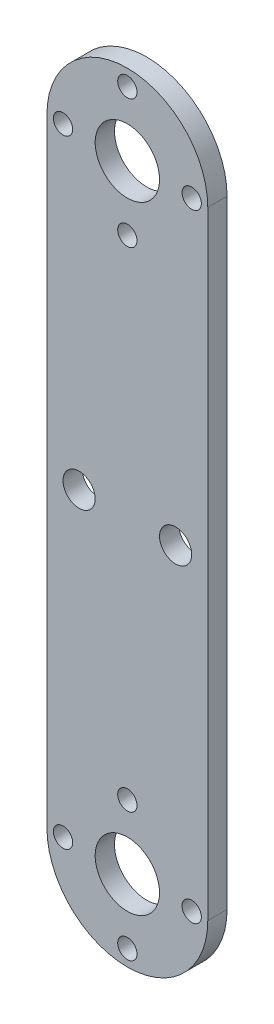
ISO-10303-21;
HEADER;
FILE_DESCRIPTION(('STEP AP214'),'2;1');
FILE_NAME('part.step','',(''),(''),'','','');
FILE_SCHEMA(('AUTOMOTIVE_DESIGN { 1 0 10303 214 1 1 1 1 }'));
ENDSEC;
DATA;
#1=APPLICATION_CONTEXT('core data for automotive mechanical design processes');
#2=APPLICATION_PROTOCOL_DEFINITION('international standard','automotive_design',2000,#1);
#3=PRODUCT_CONTEXT('',#1,'mechanical');
#4=PRODUCT('Part','Part','',(#3));
#5=PRODUCT_RELATED_PRODUCT_CATEGORY('part','',(#4));
#6=PRODUCT_DEFINITION_FORMATION('','',#4);
#7=PRODUCT_DEFINITION_CONTEXT('part definition',#1,'design');
#8=PRODUCT_DEFINITION('design','',#6,#7);
#9=PRODUCT_DEFINITION_SHAPE('','',#8);
#10=(LENGTH_UNIT() NAMED_UNIT(*) SI_UNIT(.MILLI.,.METRE.));
#11=(NAMED_UNIT(*) PLANE_ANGLE_UNIT() SI_UNIT($,.RADIAN.));
#12=(NAMED_UNIT(*) SI_UNIT($,.STERADIAN.) SOLID_ANGLE_UNIT());
#13=UNCERTAINTY_MEASURE_WITH_UNIT(LENGTH_MEASURE(1.E-05),#10,'distance_accuracy_value','');
#14=(GEOMETRIC_REPRESENTATION_CONTEXT(3) GLOBAL_UNCERTAINTY_ASSIGNED_CONTEXT((#13)) GLOBAL_UNIT_ASSIGNED_CONTEXT((#10,
#11,#12)) REPRESENTATION_CONTEXT('',''));
#15=CARTESIAN_POINT('',(0.,0.,0.));
#16=DIRECTION('',(0.,0.,1.));
#17=DIRECTION('',(1.,0.,0.));
#18=AXIS2_PLACEMENT_3D('',#15,#16,#17);
#19=CARTESIAN_POINT('',(1.25,0.,0.3));
#20=DIRECTION('',(0.,0.,1.));
#21=DIRECTION('',(1.,0.,0.));
#22=AXIS2_PLACEMENT_3D('',#19,#20,#21);
#23=PLANE('',#22);
#24=CARTESIAN_POINT('',(1.25000000000001,-1.,0.3));
#25=DIRECTION('',(0.,0.,1.));
#26=DIRECTION('',(0.,-1.,0.));
#27=AXIS2_PLACEMENT_3D('',#24,#25,#26);
#28=CIRCLE('',#27,0.15);
#29=CARTESIAN_POINT('',(1.25000000000001,-1.15,0.3));
#30=VERTEX_POINT('',#29);
#31=EDGE_CURVE('E147',#30,#30,#28,.T.);
#32=ORIENTED_EDGE('',*,*,#31,.F.);
#33=EDGE_LOOP('',(#32));
#34=FACE_BOUND('',#33,.T.);
#35=CARTESIAN_POINT('',(0.25,0.,0.3));
#36=DIRECTION('',(0.,0.,1.));
#37=DIRECTION('',(-1.,0.,0.));
#38=AXIS2_PLACEMENT_3D('',#35,#36,#37);
#39=CIRCLE('',#38,0.15);
#40=CARTESIAN_POINT('',(0.0999999999999997,0.,0.3));
#41=VERTEX_POINT('',#40);
#42=EDGE_CURVE('E137',#41,#41,#39,.T.);
#43=ORIENTED_EDGE('',*,*,#42,.F.);
#44=EDGE_LOOP('',(#43));
#45=FACE_BOUND('',#44,.T.);
#46=CARTESIAN_POINT('',(1.25,1.,0.3));
#47=DIRECTION('',(0.,0.,1.));
#48=DIRECTION('',(0.,1.,0.));
#49=AXIS2_PLACEMENT_3D('',#46,#47,#48);
#50=CIRCLE('',#49,0.15);
#51=CARTESIAN_POINT('',(1.25,1.15,0.3));
#52=VERTEX_POINT('',#51);
#53=EDGE_CURVE('E134',#52,#52,#50,.T.);
#54=ORIENTED_EDGE('',*,*,#53,.F.);
#55=EDGE_LOOP('',(#54));
#56=FACE_BOUND('',#55,.T.);
#57=CARTESIAN_POINT('',(2.25,0.,0.3));
#58=DIRECTION('',(0.,0.,1.));
#59=DIRECTION('',(1.,0.,0.));
#60=AXIS2_PLACEMENT_3D('',#57,#58,#59);
#61=CIRCLE('',#60,0.15);
#62=CARTESIAN_POINT('',(2.4,0.,0.3));
#63=VERTEX_POINT('',#62);
#64=EDGE_CURVE('E131',#63,#63,#61,.T.);
#65=ORIENTED_EDGE('',*,*,#64,.F.);
#66=EDGE_LOOP('',(#65));
#67=FACE_BOUND('',#66,.T.);
#68=CARTESIAN_POINT('',(1.24999999999999,10.6,0.3));
#69=DIRECTION('',(0.,0.,1.));
#70=DIRECTION('',(0.,-1.,0.));
#71=AXIS2_PLACEMENT_3D('',#68,#69,#70);
#72=CIRCLE('',#71,0.15);
#73=CARTESIAN_POINT('',(1.24999999999999,10.45,0.3));
#74=VERTEX_POINT('',#73);
#75=EDGE_CURVE('E127',#74,#74,#72,.T.);
#76=ORIENTED_EDGE('',*,*,#75,.F.);
#77=EDGE_LOOP('',(#76));
#78=FACE_BOUND('',#77,.T.);
#79=CARTESIAN_POINT('',(2.25,9.6,0.3));
#80=DIRECTION('',(0.,0.,1.));
#81=DIRECTION('',(-1.,0.,0.));
#82=AXIS2_PLACEMENT_3D('',#79,#80,#81);
#83=CIRCLE('',#82,0.15);
#84=CARTESIAN_POINT('',(2.1,9.6,0.3));
#85=VERTEX_POINT('',#84);
#86=EDGE_CURVE('E123',#85,#85,#83,.T.);
#87=ORIENTED_EDGE('',*,*,#86,.F.);
#88=EDGE_LOOP('',(#87));
#89=FACE_BOUND('',#88,.T.);
#90=CARTESIAN_POINT('',(1.25,8.6,0.3));
#91=DIRECTION('',(0.,0.,1.));
#92=DIRECTION('',(0.,1.,0.));
#93=AXIS2_PLACEMENT_3D('',#90,#91,#92);
#94=CIRCLE('',#93,0.15);
#95=CARTESIAN_POINT('',(1.25,8.75,0.3));
#96=VERTEX_POINT('',#95);
#97=EDGE_CURVE('E119',#96,#96,#94,.T.);
#98=ORIENTED_EDGE('',*,*,#97,.F.);
#99=EDGE_LOOP('',(#98));
#100=FACE_BOUND('',#99,.T.);
#101=CARTESIAN_POINT('',(0.249999999999999,9.6,0.3));
#102=DIRECTION('',(0.,0.,1.));
#103=DIRECTION('',(1.,0.,0.));
#104=AXIS2_PLACEMENT_3D('',#101,#102,#103);
#105=CIRCLE('',#104,0.15);
#106=CARTESIAN_POINT('',(0.4,9.6,0.3));
#107=VERTEX_POINT('',#106);
#108=EDGE_CURVE('E115',#107,#107,#105,.T.);
#109=ORIENTED_EDGE('',*,*,#108,.F.);
#110=EDGE_LOOP('',(#109));
#111=FACE_BOUND('',#110,.T.);
#112=CARTESIAN_POINT('',(0.5,4.8,0.3));
#113=DIRECTION('',(0.,0.,1.));
#114=DIRECTION('',(1.,0.,0.));
#115=AXIS2_PLACEMENT_3D('',#112,#113,#114);
#116=CIRCLE('',#115,0.25);
#117=CARTESIAN_POINT('',(0.75,4.8,0.3));
#118=VERTEX_POINT('',#117);
#119=EDGE_CURVE('E166',#118,#118,#116,.T.);
#120=ORIENTED_EDGE('',*,*,#119,.F.);
#121=EDGE_LOOP('',(#120));
#122=FACE_BOUND('',#121,.T.);
#123=CARTESIAN_POINT('',(1.25,9.6,0.3));
#124=DIRECTION('',(0.,0.,1.));
#125=DIRECTION('',(1.,0.,0.));
#126=AXIS2_PLACEMENT_3D('',#123,#124,#125);
#127=CIRCLE('',#126,0.5);
#128=CARTESIAN_POINT('',(1.75,9.6,0.3));
#129=VERTEX_POINT('',#128);
#130=EDGE_CURVE('E105',#129,#129,#127,.T.);
#131=ORIENTED_EDGE('',*,*,#130,.F.);
#132=EDGE_LOOP('',(#131));
#133=FACE_BOUND('',#132,.T.);
#134=CARTESIAN_POINT('',(1.25,0.,0.3));
#135=DIRECTION('',(0.,0.,1.));
#136=DIRECTION('',(1.,0.,0.));
#137=AXIS2_PLACEMENT_3D('',#134,#135,#136);
#138=CIRCLE('',#137,1.25);
#139=CARTESIAN_POINT('',(0.,0.,0.3));
#140=VERTEX_POINT('',#139);
#141=CARTESIAN_POINT('',(2.5,0.,0.3));
#142=VERTEX_POINT('',#141);
#143=EDGE_CURVE('E89',#140,#142,#138,.T.);
#144=ORIENTED_EDGE('',*,*,#143,.T.);
#145=DIRECTION('',(0.,1.,0.));
#146=VECTOR('',#145,1.);
#147=CARTESIAN_POINT('',(2.5,0.,0.3));
#148=LINE('',#147,#146);
#149=CARTESIAN_POINT('',(2.5,9.6,0.3));
#150=VERTEX_POINT('',#149);
#151=EDGE_CURVE('E84',#142,#150,#148,.T.);
#152=ORIENTED_EDGE('',*,*,#151,.T.);
#153=CARTESIAN_POINT('',(1.25,9.6,0.3));
#154=DIRECTION('',(0.,0.,1.));
#155=DIRECTION('',(-1.,0.,0.));
#156=AXIS2_PLACEMENT_3D('',#153,#154,#155);
#157=CIRCLE('',#156,1.25);
#158=CARTESIAN_POINT('',(0.,9.6,0.3));
#159=VERTEX_POINT('',#158);
#160=EDGE_CURVE('E87',#150,#159,#157,.T.);
#161=ORIENTED_EDGE('',*,*,#160,.T.);
#162=DIRECTION('',(0.,-1.,0.));
#163=VECTOR('',#162,1.);
#164=CARTESIAN_POINT('',(0.,0.,0.3));
#165=LINE('',#164,#163);
#166=EDGE_CURVE('E54',#159,#140,#165,.T.);
#167=ORIENTED_EDGE('',*,*,#166,.T.);
#168=EDGE_LOOP('',(#144,#152,#161,#167));
#169=FACE_BOUND('',#168,.T.);
#170=CARTESIAN_POINT('',(1.25,0.,0.3));
#171=DIRECTION('',(0.,0.,1.));
#172=DIRECTION('',(1.,0.,0.));
#173=AXIS2_PLACEMENT_3D('',#170,#171,#172);
#174=CIRCLE('',#173,0.5);
#175=CARTESIAN_POINT('',(1.75,0.,0.3));
#176=VERTEX_POINT('',#175);
#177=EDGE_CURVE('E172',#176,#176,#174,.T.);
#178=ORIENTED_EDGE('',*,*,#177,.F.);
#179=EDGE_LOOP('',(#178));
#180=FACE_BOUND('',#179,.T.);
#181=CARTESIAN_POINT('',(2.,4.8,0.3));
#182=DIRECTION('',(0.,0.,1.));
#183=DIRECTION('',(1.,0.,0.));
#184=AXIS2_PLACEMENT_3D('',#181,#182,#183);
#185=CIRCLE('',#184,0.25);
#186=CARTESIAN_POINT('',(2.25,4.8,0.3));
#187=VERTEX_POINT('',#186);
#188=EDGE_CURVE('E160',#187,#187,#185,.T.);
#189=ORIENTED_EDGE('',*,*,#188,.F.);
#190=EDGE_LOOP('',(#189));
#191=FACE_BOUND('',#190,.T.);
#192=ADVANCED_FACE('F35',(#34,#45,#56,#67,#78,#89,#100,#111,#122,#133,#169,#180,#191),#23,.T.);
#193=CARTESIAN_POINT('',(1.25,0.,0.));
#194=DIRECTION('',(0.,0.,1.));
#195=DIRECTION('',(1.,0.,0.));
#196=AXIS2_PLACEMENT_3D('',#193,#194,#195);
#197=PLANE('',#196);
#198=CARTESIAN_POINT('',(1.25000000000001,-1.,0.));
#199=DIRECTION('',(0.,0.,1.));
#200=DIRECTION('',(1.,0.,0.));
#201=AXIS2_PLACEMENT_3D('',#198,#199,#200);
#202=CIRCLE('',#201,0.15);
#203=CARTESIAN_POINT('',(1.40000000000001,-1.,0.));
#204=VERTEX_POINT('',#203);
#205=EDGE_CURVE('E39',#204,#204,#202,.T.);
#206=ORIENTED_EDGE('',*,*,#205,.T.);
#207=EDGE_LOOP('',(#206));
#208=FACE_BOUND('',#207,.T.);
#209=CARTESIAN_POINT('',(0.25,0.,0.));
#210=DIRECTION('',(0.,0.,1.));
#211=DIRECTION('',(1.,0.,0.));
#212=AXIS2_PLACEMENT_3D('',#209,#210,#211);
#213=CIRCLE('',#212,0.15);
#214=CARTESIAN_POINT('',(0.4,0.,0.));
#215=VERTEX_POINT('',#214);
#216=EDGE_CURVE('E135',#215,#215,#213,.T.);
#217=ORIENTED_EDGE('',*,*,#216,.T.);
#218=EDGE_LOOP('',(#217));
#219=FACE_BOUND('',#218,.T.);
#220=CARTESIAN_POINT('',(1.25,1.,0.));
#221=DIRECTION('',(0.,0.,1.));
#222=DIRECTION('',(1.,0.,0.));
#223=AXIS2_PLACEMENT_3D('',#220,#221,#222);
#224=CIRCLE('',#223,0.15);
#225=CARTESIAN_POINT('',(1.4,1.,0.));
#226=VERTEX_POINT('',#225);
#227=EDGE_CURVE('E132',#226,#226,#224,.T.);
#228=ORIENTED_EDGE('',*,*,#227,.T.);
#229=EDGE_LOOP('',(#228));
#230=FACE_BOUND('',#229,.T.);
#231=CARTESIAN_POINT('',(2.25,0.,0.));
#232=DIRECTION('',(0.,0.,1.));
#233=DIRECTION('',(1.,0.,0.));
#234=AXIS2_PLACEMENT_3D('',#231,#232,#233);
#235=CIRCLE('',#234,0.15);
#236=CARTESIAN_POINT('',(2.4,0.,0.));
#237=VERTEX_POINT('',#236);
#238=EDGE_CURVE('E128',#237,#237,#235,.T.);
#239=ORIENTED_EDGE('',*,*,#238,.T.);
#240=EDGE_LOOP('',(#239));
#241=FACE_BOUND('',#240,.T.);
#242=CARTESIAN_POINT('',(1.24999999999999,10.6,0.));
#243=DIRECTION('',(0.,0.,1.));
#244=DIRECTION('',(1.,0.,0.));
#245=AXIS2_PLACEMENT_3D('',#242,#243,#244);
#246=CIRCLE('',#245,0.15);
#247=CARTESIAN_POINT('',(1.39999999999999,10.6,0.));
#248=VERTEX_POINT('',#247);
#249=EDGE_CURVE('E124',#248,#248,#246,.T.);
#250=ORIENTED_EDGE('',*,*,#249,.T.);
#251=EDGE_LOOP('',(#250));
#252=FACE_BOUND('',#251,.T.);
#253=CARTESIAN_POINT('',(2.25,9.6,0.));
#254=DIRECTION('',(0.,0.,1.));
#255=DIRECTION('',(1.,0.,0.));
#256=AXIS2_PLACEMENT_3D('',#253,#254,#255);
#257=CIRCLE('',#256,0.15);
#258=CARTESIAN_POINT('',(2.4,9.6,0.));
#259=VERTEX_POINT('',#258);
#260=EDGE_CURVE('E120',#259,#259,#257,.T.);
#261=ORIENTED_EDGE('',*,*,#260,.T.);
#262=EDGE_LOOP('',(#261));
#263=FACE_BOUND('',#262,.T.);
#264=CARTESIAN_POINT('',(1.25,8.6,0.));
#265=DIRECTION('',(0.,0.,1.));
#266=DIRECTION('',(1.,0.,0.));
#267=AXIS2_PLACEMENT_3D('',#264,#265,#266);
#268=CIRCLE('',#267,0.15);
#269=CARTESIAN_POINT('',(1.4,8.6,0.));
#270=VERTEX_POINT('',#269);
#271=EDGE_CURVE('E116',#270,#270,#268,.T.);
#272=ORIENTED_EDGE('',*,*,#271,.T.);
#273=EDGE_LOOP('',(#272));
#274=FACE_BOUND('',#273,.T.);
#275=CARTESIAN_POINT('',(0.249999999999999,9.6,0.));
#276=DIRECTION('',(0.,0.,1.));
#277=DIRECTION('',(1.,0.,0.));
#278=AXIS2_PLACEMENT_3D('',#275,#276,#277);
#279=CIRCLE('',#278,0.15);
#280=CARTESIAN_POINT('',(0.4,9.6,0.));
#281=VERTEX_POINT('',#280);
#282=EDGE_CURVE('E111',#281,#281,#279,.T.);
#283=ORIENTED_EDGE('',*,*,#282,.T.);
#284=EDGE_LOOP('',(#283));
#285=FACE_BOUND('',#284,.T.);
#286=CARTESIAN_POINT('',(0.5,4.8,0.));
#287=DIRECTION('',(0.,0.,1.));
#288=DIRECTION('',(1.,0.,0.));
#289=AXIS2_PLACEMENT_3D('',#286,#287,#288);
#290=CIRCLE('',#289,0.25);
#291=CARTESIAN_POINT('',(0.75,4.8,0.));
#292=VERTEX_POINT('',#291);
#293=EDGE_CURVE('E163',#292,#292,#290,.T.);
#294=ORIENTED_EDGE('',*,*,#293,.T.);
#295=EDGE_LOOP('',(#294));
#296=FACE_BOUND('',#295,.T.);
#297=CARTESIAN_POINT('',(1.25,9.6,0.));
#298=DIRECTION('',(0.,0.,1.));
#299=DIRECTION('',(1.,0.,0.));
#300=AXIS2_PLACEMENT_3D('',#297,#298,#299);
#301=CIRCLE('',#300,0.5);
#302=CARTESIAN_POINT('',(1.75,9.6,0.));
#303=VERTEX_POINT('',#302);
#304=EDGE_CURVE('E175',#303,#303,#301,.T.);
#305=ORIENTED_EDGE('',*,*,#304,.T.);
#306=EDGE_LOOP('',(#305));
#307=FACE_BOUND('',#306,.T.);
#308=CARTESIAN_POINT('',(1.25,0.,0.));
#309=DIRECTION('',(0.,0.,1.));
#310=DIRECTION('',(1.,0.,0.));
#311=AXIS2_PLACEMENT_3D('',#308,#309,#310);
#312=CIRCLE('',#311,1.25);
#313=CARTESIAN_POINT('',(0.,0.,0.));
#314=VERTEX_POINT('',#313);
#315=CARTESIAN_POINT('',(2.5,0.,0.));
#316=VERTEX_POINT('',#315);
#317=EDGE_CURVE('E102',#314,#316,#312,.T.);
#318=ORIENTED_EDGE('',*,*,#317,.F.);
#319=DIRECTION('',(0.,-1.,0.));
#320=VECTOR('',#319,1.);
#321=CARTESIAN_POINT('',(0.,0.,0.));
#322=LINE('',#321,#320);
#323=CARTESIAN_POINT('',(0.,9.6,0.));
#324=VERTEX_POINT('',#323);
#325=EDGE_CURVE('E77',#324,#314,#322,.T.);
#326=ORIENTED_EDGE('',*,*,#325,.F.);
#327=CARTESIAN_POINT('',(1.25,9.6,0.));
#328=DIRECTION('',(0.,0.,1.));
#329=DIRECTION('',(-1.,0.,0.));
#330=AXIS2_PLACEMENT_3D('',#327,#328,#329);
#331=CIRCLE('',#330,1.25);
#332=CARTESIAN_POINT('',(2.5,9.6,0.));
#333=VERTEX_POINT('',#332);
#334=EDGE_CURVE('E71',#333,#324,#331,.T.);
#335=ORIENTED_EDGE('',*,*,#334,.F.);
#336=DIRECTION('',(0.,1.,0.));
#337=VECTOR('',#336,1.);
#338=CARTESIAN_POINT('',(2.5,0.,0.));
#339=LINE('',#338,#337);
#340=EDGE_CURVE('E93',#316,#333,#339,.T.);
#341=ORIENTED_EDGE('',*,*,#340,.F.);
#342=EDGE_LOOP('',(#318,#326,#335,#341));
#343=FACE_BOUND('',#342,.T.);
#344=CARTESIAN_POINT('',(1.25,0.,0.));
#345=DIRECTION('',(0.,0.,1.));
#346=DIRECTION('',(1.,0.,0.));
#347=AXIS2_PLACEMENT_3D('',#344,#345,#346);
#348=CIRCLE('',#347,0.5);
#349=CARTESIAN_POINT('',(1.75,0.,0.));
#350=VERTEX_POINT('',#349);
#351=EDGE_CURVE('E169',#350,#350,#348,.T.);
#352=ORIENTED_EDGE('',*,*,#351,.T.);
#353=EDGE_LOOP('',(#352));
#354=FACE_BOUND('',#353,.T.);
#355=CARTESIAN_POINT('',(2.,4.8,0.));
#356=DIRECTION('',(0.,0.,1.));
#357=DIRECTION('',(1.,0.,0.));
#358=AXIS2_PLACEMENT_3D('',#355,#356,#357);
#359=CIRCLE('',#358,0.25);
#360=CARTESIAN_POINT('',(2.25,4.8,0.));
#361=VERTEX_POINT('',#360);
#362=EDGE_CURVE('E114',#361,#361,#359,.T.);
#363=ORIENTED_EDGE('',*,*,#362,.T.);
#364=EDGE_LOOP('',(#363));
#365=FACE_BOUND('',#364,.T.);
#366=ADVANCED_FACE('F183',(#208,#219,#230,#241,#252,#263,#274,#285,#296,#307,#343,#354,#365),
#197,.F.);
#367=CARTESIAN_POINT('',(1.25,0.,0.3));
#368=DIRECTION('',(0.,0.,-1.));
#369=DIRECTION('',(-1.,0.,0.));
#370=AXIS2_PLACEMENT_3D('',#367,#368,#369);
#371=CYLINDRICAL_SURFACE('',#370,1.25);
#372=ORIENTED_EDGE('',*,*,#317,.T.);
#373=DIRECTION('',(0.,0.,-1.));
#374=VECTOR('',#373,1.);
#375=CARTESIAN_POINT('',(2.5,0.,0.3));
#376=LINE('',#375,#374);
#377=EDGE_CURVE('E11',#142,#316,#376,.T.);
#378=ORIENTED_EDGE('',*,*,#377,.F.);
#379=ORIENTED_EDGE('',*,*,#143,.F.);
#380=DIRECTION('',(0.,0.,-1.));
#381=VECTOR('',#380,1.);
#382=CARTESIAN_POINT('',(0.,0.,0.3));
#383=LINE('',#382,#381);
#384=EDGE_CURVE('E98',#140,#314,#383,.T.);
#385=ORIENTED_EDGE('',*,*,#384,.T.);
#386=EDGE_LOOP('',(#372,#378,#379,#385));
#387=FACE_BOUND('',#386,.T.);
#388=ADVANCED_FACE('F37',(#387),#371,.T.);
#389=CARTESIAN_POINT('',(2.5,0.,0.3));
#390=DIRECTION('',(-1.,0.,0.));
#391=DIRECTION('',(0.,0.,1.));
#392=AXIS2_PLACEMENT_3D('',#389,#390,#391);
#393=PLANE('',#392);
#394=ORIENTED_EDGE('',*,*,#340,.T.);
#395=DIRECTION('',(0.,0.,-1.));
#396=VECTOR('',#395,1.);
#397=CARTESIAN_POINT('',(2.5,9.6,0.3));
#398=LINE('',#397,#396);
#399=EDGE_CURVE('E45',#150,#333,#398,.T.);
#400=ORIENTED_EDGE('',*,*,#399,.F.);
#401=ORIENTED_EDGE('',*,*,#151,.F.);
#402=ORIENTED_EDGE('',*,*,#377,.T.);
#403=EDGE_LOOP('',(#394,#400,#401,#402));
#404=FACE_BOUND('',#403,.T.);
#405=ADVANCED_FACE('F92',(#404),#393,.F.);
#406=CARTESIAN_POINT('',(1.25,9.6,0.3));
#407=DIRECTION('',(0.,0.,-1.));
#408=DIRECTION('',(-1.,0.,0.));
#409=AXIS2_PLACEMENT_3D('',#406,#407,#408);
#410=CYLINDRICAL_SURFACE('',#409,1.25);
#411=ORIENTED_EDGE('',*,*,#334,.T.);
#412=DIRECTION('',(0.,0.,-1.));
#413=VECTOR('',#412,1.);
#414=CARTESIAN_POINT('',(0.,9.6,0.3));
#415=LINE('',#414,#413);
#416=EDGE_CURVE('E94',#159,#324,#415,.T.);
#417=ORIENTED_EDGE('',*,*,#416,.F.);
#418=ORIENTED_EDGE('',*,*,#160,.F.);
#419=ORIENTED_EDGE('',*,*,#399,.T.);
#420=EDGE_LOOP('',(#411,#417,#418,#419));
#421=FACE_BOUND('',#420,.T.);
#422=ADVANCED_FACE('F96',(#421),#410,.T.);
#423=CARTESIAN_POINT('',(0.,0.,0.3));
#424=DIRECTION('',(1.,0.,0.));
#425=DIRECTION('',(0.,0.,-1.));
#426=AXIS2_PLACEMENT_3D('',#423,#424,#425);
#427=PLANE('',#426);
#428=ORIENTED_EDGE('',*,*,#325,.T.);
#429=ORIENTED_EDGE('',*,*,#384,.F.);
#430=ORIENTED_EDGE('',*,*,#166,.F.);
#431=ORIENTED_EDGE('',*,*,#416,.T.);
#432=EDGE_LOOP('',(#428,#429,#430,#431));
#433=FACE_BOUND('',#432,.T.);
#434=ADVANCED_FACE('F189',(#433),#427,.F.);
#435=CARTESIAN_POINT('',(1.25,9.6,0.3));
#436=DIRECTION('',(0.,0.,-1.));
#437=DIRECTION('',(-1.,0.,0.));
#438=AXIS2_PLACEMENT_3D('',#435,#436,#437);
#439=CYLINDRICAL_SURFACE('',#438,0.5);
#440=ORIENTED_EDGE('',*,*,#130,.T.);
#441=EDGE_LOOP('',(#440));
#442=FACE_BOUND('',#441,.T.);
#443=ORIENTED_EDGE('',*,*,#304,.F.);
#444=EDGE_LOOP('',(#443));
#445=FACE_BOUND('',#444,.T.);
#446=ADVANCED_FACE('F186',(#442,#445),#439,.F.);
#447=CARTESIAN_POINT('',(1.25,0.,0.3));
#448=DIRECTION('',(0.,0.,-1.));
#449=DIRECTION('',(-1.,0.,0.));
#450=AXIS2_PLACEMENT_3D('',#447,#448,#449);
#451=CYLINDRICAL_SURFACE('',#450,0.5);
#452=ORIENTED_EDGE('',*,*,#177,.T.);
#453=EDGE_LOOP('',(#452));
#454=FACE_BOUND('',#453,.T.);
#455=ORIENTED_EDGE('',*,*,#351,.F.);
#456=EDGE_LOOP('',(#455));
#457=FACE_BOUND('',#456,.T.);
#458=ADVANCED_FACE('F188',(#454,#457),#451,.F.);
#459=CARTESIAN_POINT('',(0.5,4.8,0.3));
#460=DIRECTION('',(0.,0.,-1.));
#461=DIRECTION('',(-1.,0.,0.));
#462=AXIS2_PLACEMENT_3D('',#459,#460,#461);
#463=CYLINDRICAL_SURFACE('',#462,0.25);
#464=ORIENTED_EDGE('',*,*,#119,.T.);
#465=EDGE_LOOP('',(#464));
#466=FACE_BOUND('',#465,.T.);
#467=ORIENTED_EDGE('',*,*,#293,.F.);
#468=EDGE_LOOP('',(#467));
#469=FACE_BOUND('',#468,.T.);
#470=ADVANCED_FACE('F196',(#466,#469),#463,.F.);
#471=CARTESIAN_POINT('',(2.,4.8,0.3));
#472=DIRECTION('',(0.,0.,-1.));
#473=DIRECTION('',(-1.,0.,0.));
#474=AXIS2_PLACEMENT_3D('',#471,#472,#473);
#475=CYLINDRICAL_SURFACE('',#474,0.25);
#476=ORIENTED_EDGE('',*,*,#188,.T.);
#477=EDGE_LOOP('',(#476));
#478=FACE_BOUND('',#477,.T.);
#479=ORIENTED_EDGE('',*,*,#362,.F.);
#480=EDGE_LOOP('',(#479));
#481=FACE_BOUND('',#480,.T.);
#482=ADVANCED_FACE('F225',(#478,#481),#475,.F.);
#483=CARTESIAN_POINT('',(0.249999999999999,9.6,-9.7));
#484=DIRECTION('',(0.,0.,1.));
#485=DIRECTION('',(1.,0.,0.));
#486=AXIS2_PLACEMENT_3D('',#483,#484,#485);
#487=CYLINDRICAL_SURFACE('',#486,0.15);
#488=ORIENTED_EDGE('',*,*,#108,.T.);
#489=EDGE_LOOP('',(#488));
#490=FACE_BOUND('',#489,.T.);
#491=ORIENTED_EDGE('',*,*,#282,.F.);
#492=EDGE_LOOP('',(#491));
#493=FACE_BOUND('',#492,.T.);
#494=ADVANCED_FACE('F227',(#490,#493),#487,.F.);
#495=CARTESIAN_POINT('',(1.25,8.6,-9.7));
#496=DIRECTION('',(0.,0.,1.));
#497=DIRECTION('',(1.,0.,0.));
#498=AXIS2_PLACEMENT_3D('',#495,#496,#497);
#499=CYLINDRICAL_SURFACE('',#498,0.15);
#500=ORIENTED_EDGE('',*,*,#97,.T.);
#501=EDGE_LOOP('',(#500));
#502=FACE_BOUND('',#501,.T.);
#503=ORIENTED_EDGE('',*,*,#271,.F.);
#504=EDGE_LOOP('',(#503));
#505=FACE_BOUND('',#504,.T.);
#506=ADVANCED_FACE('F234',(#502,#505),#499,.F.);
#507=CARTESIAN_POINT('',(2.25,9.6,-9.7));
#508=DIRECTION('',(0.,0.,1.));
#509=DIRECTION('',(1.,0.,0.));
#510=AXIS2_PLACEMENT_3D('',#507,#508,#509);
#511=CYLINDRICAL_SURFACE('',#510,0.15);
#512=ORIENTED_EDGE('',*,*,#86,.T.);
#513=EDGE_LOOP('',(#512));
#514=FACE_BOUND('',#513,.T.);
#515=ORIENTED_EDGE('',*,*,#260,.F.);
#516=EDGE_LOOP('',(#515));
#517=FACE_BOUND('',#516,.T.);
#518=ADVANCED_FACE('F242',(#514,#517),#511,.F.);
#519=CARTESIAN_POINT('',(1.24999999999999,10.6,-9.7));
#520=DIRECTION('',(0.,0.,1.));
#521=DIRECTION('',(1.,0.,0.));
#522=AXIS2_PLACEMENT_3D('',#519,#520,#521);
#523=CYLINDRICAL_SURFACE('',#522,0.15);
#524=ORIENTED_EDGE('',*,*,#75,.T.);
#525=EDGE_LOOP('',(#524));
#526=FACE_BOUND('',#525,.T.);
#527=ORIENTED_EDGE('',*,*,#249,.F.);
#528=EDGE_LOOP('',(#527));
#529=FACE_BOUND('',#528,.T.);
#530=ADVANCED_FACE('F246',(#526,#529),#523,.F.);
#531=CARTESIAN_POINT('',(2.25,0.,-9.7));
#532=DIRECTION('',(0.,0.,1.));
#533=DIRECTION('',(1.,0.,0.));
#534=AXIS2_PLACEMENT_3D('',#531,#532,#533);
#535=CYLINDRICAL_SURFACE('',#534,0.15);
#536=ORIENTED_EDGE('',*,*,#64,.T.);
#537=EDGE_LOOP('',(#536));
#538=FACE_BOUND('',#537,.T.);
#539=ORIENTED_EDGE('',*,*,#238,.F.);
#540=EDGE_LOOP('',(#539));
#541=FACE_BOUND('',#540,.T.);
#542=ADVANCED_FACE('F250',(#538,#541),#535,.F.);
#543=CARTESIAN_POINT('',(1.25,1.,-9.7));
#544=DIRECTION('',(0.,0.,1.));
#545=DIRECTION('',(1.,0.,0.));
#546=AXIS2_PLACEMENT_3D('',#543,#544,#545);
#547=CYLINDRICAL_SURFACE('',#546,0.15);
#548=ORIENTED_EDGE('',*,*,#53,.T.);
#549=EDGE_LOOP('',(#548));
#550=FACE_BOUND('',#549,.T.);
#551=ORIENTED_EDGE('',*,*,#227,.F.);
#552=EDGE_LOOP('',(#551));
#553=FACE_BOUND('',#552,.T.);
#554=ADVANCED_FACE('F254',(#550,#553),#547,.F.);
#555=CARTESIAN_POINT('',(0.25,0.,-9.7));
#556=DIRECTION('',(0.,0.,1.));
#557=DIRECTION('',(1.,0.,0.));
#558=AXIS2_PLACEMENT_3D('',#555,#556,#557);
#559=CYLINDRICAL_SURFACE('',#558,0.15);
#560=ORIENTED_EDGE('',*,*,#42,.T.);
#561=EDGE_LOOP('',(#560));
#562=FACE_BOUND('',#561,.T.);
#563=ORIENTED_EDGE('',*,*,#216,.F.);
#564=EDGE_LOOP('',(#563));
#565=FACE_BOUND('',#564,.T.);
#566=ADVANCED_FACE('F258',(#562,#565),#559,.F.);
#567=CARTESIAN_POINT('',(1.25000000000001,-1.,-9.7));
#568=DIRECTION('',(0.,0.,1.));
#569=DIRECTION('',(1.,0.,0.));
#570=AXIS2_PLACEMENT_3D('',#567,#568,#569);
#571=CYLINDRICAL_SURFACE('',#570,0.15);
#572=ORIENTED_EDGE('',*,*,#31,.T.);
#573=EDGE_LOOP('',(#572));
#574=FACE_BOUND('',#573,.T.);
#575=ORIENTED_EDGE('',*,*,#205,.F.);
#576=EDGE_LOOP('',(#575));
#577=FACE_BOUND('',#576,.T.);
#578=ADVANCED_FACE('F262',(#574,#577),#571,.F.);
#579=CLOSED_SHELL('',(#192,#366,#388,#405,#422,#434,#446,#458,#470,#482,#494,#506,#518,#530,
#542,#554,#566,#578));
#580=MANIFOLD_SOLID_BREP('B2',#579);
#581=ADVANCED_BREP_SHAPE_REPRESENTATION('',(#18,#580),#14);
#582=SHAPE_DEFINITION_REPRESENTATION(#9,#581);
ENDSEC;
END-ISO-10303-21;
